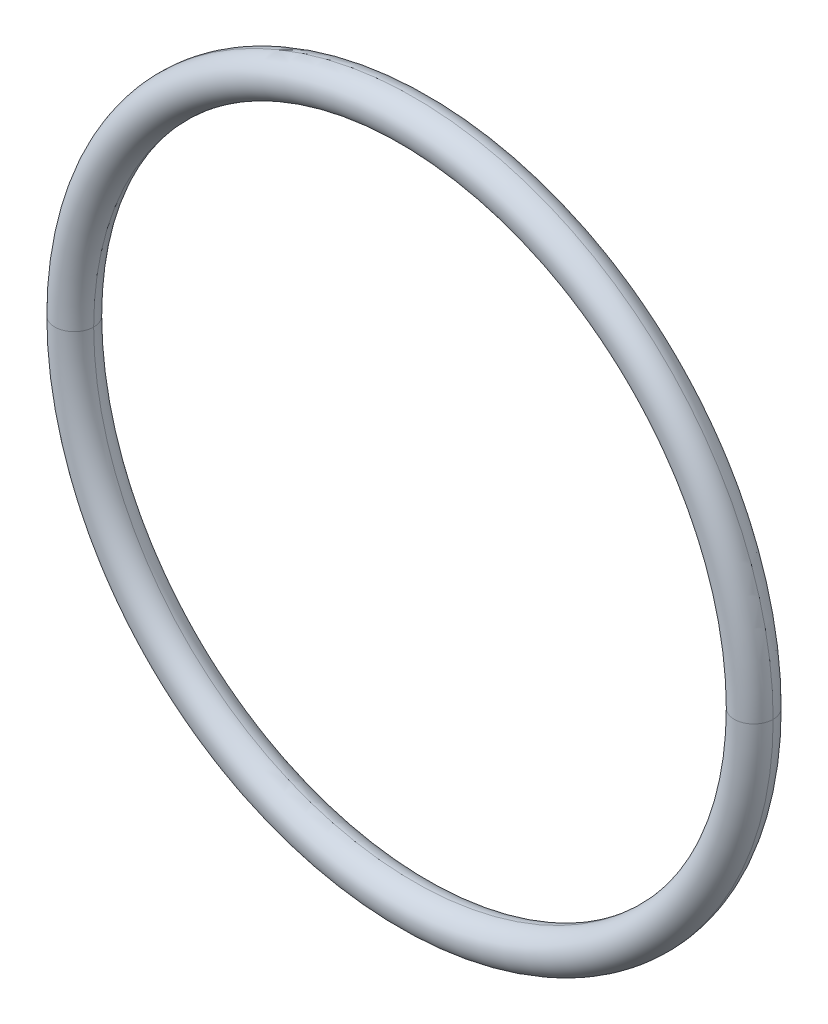
ISO-10303-21;
HEADER;
FILE_DESCRIPTION(('STEP AP214'),'2;1');
FILE_NAME('part.step','',(''),(''),'','','');
FILE_SCHEMA(('AUTOMOTIVE_DESIGN { 1 0 10303 214 1 1 1 1 }'));
ENDSEC;
DATA;
#1=APPLICATION_CONTEXT('core data for automotive mechanical design processes');
#2=APPLICATION_PROTOCOL_DEFINITION('international standard','automotive_design',2000,#1);
#3=PRODUCT_CONTEXT('',#1,'mechanical');
#4=PRODUCT('Part','Part','',(#3));
#5=PRODUCT_RELATED_PRODUCT_CATEGORY('part','',(#4));
#6=PRODUCT_DEFINITION_FORMATION('','',#4);
#7=PRODUCT_DEFINITION_CONTEXT('part definition',#1,'design');
#8=PRODUCT_DEFINITION('design','',#6,#7);
#9=PRODUCT_DEFINITION_SHAPE('','',#8);
#10=(LENGTH_UNIT() NAMED_UNIT(*) SI_UNIT(.MILLI.,.METRE.));
#11=(NAMED_UNIT(*) PLANE_ANGLE_UNIT() SI_UNIT($,.RADIAN.));
#12=(NAMED_UNIT(*) SI_UNIT($,.STERADIAN.) SOLID_ANGLE_UNIT());
#13=UNCERTAINTY_MEASURE_WITH_UNIT(LENGTH_MEASURE(1.E-05),#10,'distance_accuracy_value','');
#14=(GEOMETRIC_REPRESENTATION_CONTEXT(3) GLOBAL_UNCERTAINTY_ASSIGNED_CONTEXT((#13)) GLOBAL_UNIT_ASSIGNED_CONTEXT((#10,
#11,#12)) REPRESENTATION_CONTEXT('',''));
#15=CARTESIAN_POINT('',(0.,0.,0.));
#16=DIRECTION('',(0.,0.,1.));
#17=DIRECTION('',(1.,0.,0.));
#18=AXIS2_PLACEMENT_3D('',#15,#16,#17);
#19=CARTESIAN_POINT('',(-17.5,0.,0.));
#20=DIRECTION('',(0.,0.,-1.));
#21=DIRECTION('',(-1.,0.,0.));
#22=AXIS2_PLACEMENT_3D('',#19,#20,#21);
#23=TOROIDAL_SURFACE('',#22,17.5,1.);
#24=CARTESIAN_POINT('',(-17.5,0.,0.));
#25=DIRECTION('',(0.,0.,-1.));
#26=DIRECTION('',(-1.,0.,0.));
#27=AXIS2_PLACEMENT_3D('',#24,#25,#26);
#28=CIRCLE('',#27,18.5);
#29=CARTESIAN_POINT('',(1.,0.,0.));
#30=VERTEX_POINT('',#29);
#31=CARTESIAN_POINT('',(-36.,0.,0.));
#32=VERTEX_POINT('',#31);
#33=EDGE_CURVE('E60',#30,#32,#28,.T.);
#34=ORIENTED_EDGE('',*,*,#33,.F.);
#35=CARTESIAN_POINT('',(0.,0.,0.));
#36=DIRECTION('',(0.,1.,0.));
#37=DIRECTION('',(-1.,0.,0.));
#38=AXIS2_PLACEMENT_3D('',#35,#36,#37);
#39=CIRCLE('',#38,1.);
#40=CARTESIAN_POINT('',(-1.,0.,0.));
#41=VERTEX_POINT('',#40);
#42=EDGE_CURVE('E11',#41,#30,#39,.T.);
#43=ORIENTED_EDGE('',*,*,#42,.F.);
#44=CARTESIAN_POINT('',(-17.5,0.,0.));
#45=DIRECTION('',(0.,0.,-1.));
#46=DIRECTION('',(-1.,0.,0.));
#47=AXIS2_PLACEMENT_3D('',#44,#45,#46);
#48=CIRCLE('',#47,16.5);
#49=CARTESIAN_POINT('',(-34.,0.,0.));
#50=VERTEX_POINT('',#49);
#51=EDGE_CURVE('E57',#41,#50,#48,.T.);
#52=ORIENTED_EDGE('',*,*,#51,.T.);
#53=CARTESIAN_POINT('',(-35.,0.,0.));
#54=DIRECTION('',(0.,-1.,0.));
#55=DIRECTION('',(0.,0.,-1.));
#56=AXIS2_PLACEMENT_3D('',#53,#54,#55);
#57=CIRCLE('',#56,1.);
#58=EDGE_CURVE('E27',#50,#32,#57,.T.);
#59=ORIENTED_EDGE('',*,*,#58,.T.);
#60=EDGE_LOOP('',(#34,#43,#52,#59));
#61=FACE_BOUND('',#60,.T.);
#62=ADVANCED_FACE('F17',(#61),#23,.T.);
#63=CARTESIAN_POINT('',(-17.5,0.,0.));
#64=DIRECTION('',(0.,0.,-1.));
#65=DIRECTION('',(-1.,0.,0.));
#66=AXIS2_PLACEMENT_3D('',#63,#64,#65);
#67=TOROIDAL_SURFACE('',#66,17.5,1.);
#68=CARTESIAN_POINT('',(-17.5,0.,0.));
#69=DIRECTION('',(0.,0.,-1.));
#70=DIRECTION('',(-1.,0.,0.));
#71=AXIS2_PLACEMENT_3D('',#68,#69,#70);
#72=CIRCLE('',#71,18.5);
#73=EDGE_CURVE('E68',#32,#30,#72,.T.);
#74=ORIENTED_EDGE('',*,*,#73,.F.);
#75=ORIENTED_EDGE('',*,*,#58,.F.);
#76=CARTESIAN_POINT('',(-17.5,0.,0.));
#77=DIRECTION('',(0.,0.,-1.));
#78=DIRECTION('',(-1.,0.,0.));
#79=AXIS2_PLACEMENT_3D('',#76,#77,#78);
#80=CIRCLE('',#79,16.5);
#81=EDGE_CURVE('E62',#50,#41,#80,.T.);
#82=ORIENTED_EDGE('',*,*,#81,.T.);
#83=ORIENTED_EDGE('',*,*,#42,.T.);
#84=EDGE_LOOP('',(#74,#75,#82,#83));
#85=FACE_BOUND('',#84,.T.);
#86=ADVANCED_FACE('F63',(#85),#67,.T.);
#87=CARTESIAN_POINT('',(-17.5,0.,0.));
#88=DIRECTION('',(0.,0.,-1.));
#89=DIRECTION('',(-1.,0.,0.));
#90=AXIS2_PLACEMENT_3D('',#87,#88,#89);
#91=TOROIDAL_SURFACE('',#90,17.5,1.);
#92=CARTESIAN_POINT('',(-35.,0.,0.));
#93=DIRECTION('',(0.,-1.,0.));
#94=DIRECTION('',(0.,0.,-1.));
#95=AXIS2_PLACEMENT_3D('',#92,#93,#94);
#96=CIRCLE('',#95,1.);
#97=EDGE_CURVE('E71',#32,#50,#96,.T.);
#98=ORIENTED_EDGE('',*,*,#97,.F.);
#99=ORIENTED_EDGE('',*,*,#73,.T.);
#100=CARTESIAN_POINT('',(0.,0.,0.));
#101=DIRECTION('',(0.,1.,0.));
#102=DIRECTION('',(-1.,0.,0.));
#103=AXIS2_PLACEMENT_3D('',#100,#101,#102);
#104=CIRCLE('',#103,1.);
#105=EDGE_CURVE('E20',#30,#41,#104,.T.);
#106=ORIENTED_EDGE('',*,*,#105,.T.);
#107=ORIENTED_EDGE('',*,*,#81,.F.);
#108=EDGE_LOOP('',(#98,#99,#106,#107));
#109=FACE_BOUND('',#108,.T.);
#110=ADVANCED_FACE('F74',(#109),#91,.T.);
#111=CARTESIAN_POINT('',(-17.5,0.,0.));
#112=DIRECTION('',(0.,0.,-1.));
#113=DIRECTION('',(-1.,0.,0.));
#114=AXIS2_PLACEMENT_3D('',#111,#112,#113);
#115=TOROIDAL_SURFACE('',#114,17.5,1.);
#116=ORIENTED_EDGE('',*,*,#105,.F.);
#117=ORIENTED_EDGE('',*,*,#33,.T.);
#118=ORIENTED_EDGE('',*,*,#97,.T.);
#119=ORIENTED_EDGE('',*,*,#51,.F.);
#120=EDGE_LOOP('',(#116,#117,#118,#119));
#121=FACE_BOUND('',#120,.T.);
#122=ADVANCED_FACE('F70',(#121),#115,.T.);
#123=CLOSED_SHELL('',(#62,#86,#110,#122));
#124=MANIFOLD_SOLID_BREP('B1',#123);
#125=ADVANCED_BREP_SHAPE_REPRESENTATION('',(#18,#124),#14);
#126=SHAPE_DEFINITION_REPRESENTATION(#9,#125);
ENDSEC;
END-ISO-10303-21;
